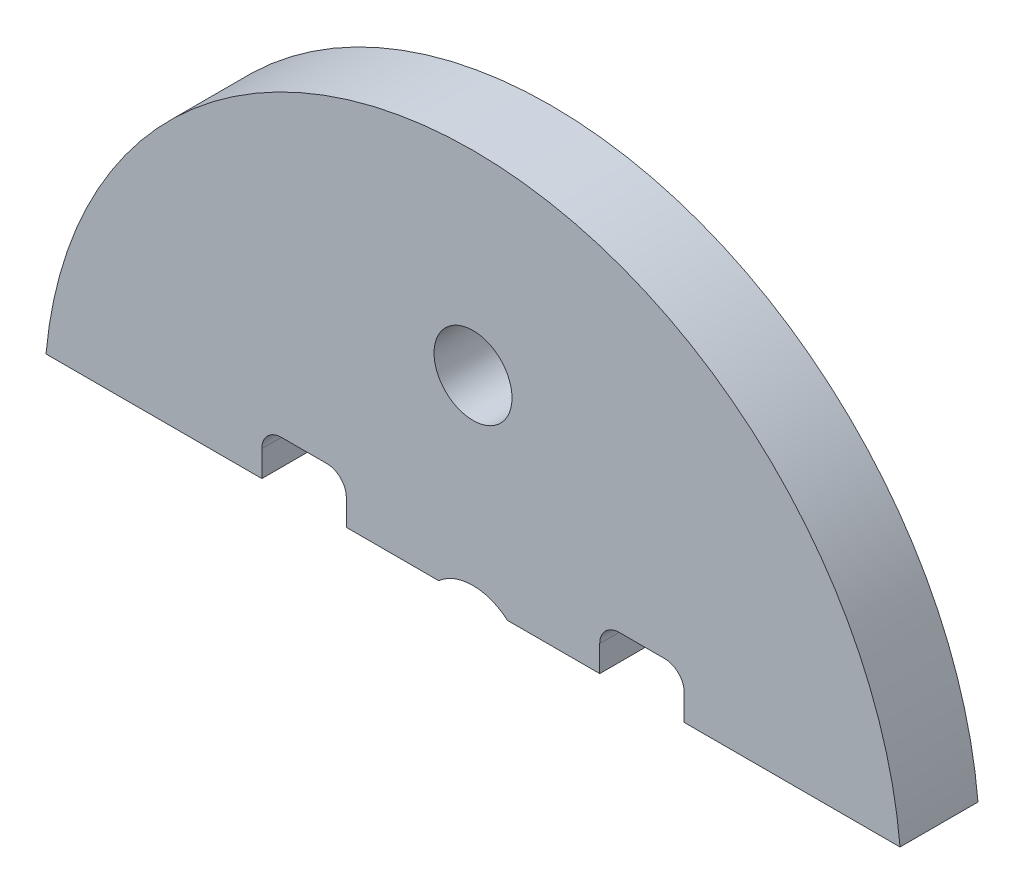
ISO-10303-21;
HEADER;
FILE_DESCRIPTION(('STEP AP214'),'2;1');
FILE_NAME('part.step','',(''),(''),'','','');
FILE_SCHEMA(('AUTOMOTIVE_DESIGN { 1 0 10303 214 1 1 1 1 }'));
ENDSEC;
DATA;
#1=APPLICATION_CONTEXT('core data for automotive mechanical design processes');
#2=APPLICATION_PROTOCOL_DEFINITION('international standard','automotive_design',2000,#1);
#3=PRODUCT_CONTEXT('',#1,'mechanical');
#4=PRODUCT('Part','Part','',(#3));
#5=PRODUCT_RELATED_PRODUCT_CATEGORY('part','',(#4));
#6=PRODUCT_DEFINITION_FORMATION('','',#4);
#7=PRODUCT_DEFINITION_CONTEXT('part definition',#1,'design');
#8=PRODUCT_DEFINITION('design','',#6,#7);
#9=PRODUCT_DEFINITION_SHAPE('','',#8);
#10=(LENGTH_UNIT() NAMED_UNIT(*) SI_UNIT(.MILLI.,.METRE.));
#11=(NAMED_UNIT(*) PLANE_ANGLE_UNIT() SI_UNIT($,.RADIAN.));
#12=(NAMED_UNIT(*) SI_UNIT($,.STERADIAN.) SOLID_ANGLE_UNIT());
#13=UNCERTAINTY_MEASURE_WITH_UNIT(LENGTH_MEASURE(1.E-05),#10,'distance_accuracy_value','');
#14=(GEOMETRIC_REPRESENTATION_CONTEXT(3) GLOBAL_UNCERTAINTY_ASSIGNED_CONTEXT((#13)) GLOBAL_UNIT_ASSIGNED_CONTEXT((#10,
#11,#12)) REPRESENTATION_CONTEXT('',''));
#15=CARTESIAN_POINT('',(0.,0.,0.));
#16=DIRECTION('',(0.,0.,1.));
#17=DIRECTION('',(1.,0.,0.));
#18=AXIS2_PLACEMENT_3D('',#15,#16,#17);
#19=CARTESIAN_POINT('',(221.3728079135,244.4520199932,3.));
#20=DIRECTION('',(0.,0.,1.));
#21=DIRECTION('',(1.,0.,0.));
#22=AXIS2_PLACEMENT_3D('',#19,#20,#21);
#23=PLANE('',#22);
#24=CARTESIAN_POINT('',(221.3728079135,244.4520199932,3.));
#25=DIRECTION('',(0.,0.,-1.));
#26=DIRECTION('',(1.,0.,0.));
#27=AXIS2_PLACEMENT_3D('',#24,#25,#26);
#28=CIRCLE('',#27,0.750000000000001);
#29=CARTESIAN_POINT('',(220.6228079135,244.4520199932,3.));
#30=VERTEX_POINT('',#29);
#31=CARTESIAN_POINT('',(221.3728079135,245.2020199932,3.));
#32=VERTEX_POINT('',#31);
#33=EDGE_CURVE('E209',#30,#32,#28,.T.);
#34=ORIENTED_EDGE('',*,*,#33,.T.);
#35=DIRECTION('',(1.,0.,0.));
#36=VECTOR('',#35,1.);
#37=CARTESIAN_POINT('',(223.1228079135,245.2020199932,3.));
#38=LINE('',#37,#36);
#39=CARTESIAN_POINT('',(223.1228079135,245.2020199932,3.));
#40=VERTEX_POINT('',#39);
#41=EDGE_CURVE('E117',#32,#40,#38,.T.);
#42=ORIENTED_EDGE('',*,*,#41,.T.);
#43=CARTESIAN_POINT('',(223.1228079135,244.4520199932,3.));
#44=DIRECTION('',(0.,0.,-1.));
#45=DIRECTION('',(1.,0.,0.));
#46=AXIS2_PLACEMENT_3D('',#43,#44,#45);
#47=CIRCLE('',#46,0.750000000000001);
#48=CARTESIAN_POINT('',(223.8728079135,244.4520199932,3.));
#49=VERTEX_POINT('',#48);
#50=EDGE_CURVE('E248',#40,#49,#47,.T.);
#51=ORIENTED_EDGE('',*,*,#50,.T.);
#52=DIRECTION('',(0.,-1.,0.));
#53=VECTOR('',#52,1.);
#54=CARTESIAN_POINT('',(223.8728079135,243.4520199932,3.));
#55=LINE('',#54,#53);
#56=CARTESIAN_POINT('',(223.8728079135,243.4520199932,3.));
#57=VERTEX_POINT('',#56);
#58=EDGE_CURVE('E267',#49,#57,#55,.T.);
#59=ORIENTED_EDGE('',*,*,#58,.T.);
#60=DIRECTION('',(1.,0.,0.));
#61=VECTOR('',#60,1.);
#62=CARTESIAN_POINT('',(223.8728079135,243.4520199932,3.));
#63=LINE('',#62,#61);
#64=CARTESIAN_POINT('',(232.1794846387,243.4520199932,3.));
#65=VERTEX_POINT('',#64);
#66=EDGE_CURVE('E264',#57,#65,#63,.T.);
#67=ORIENTED_EDGE('',*,*,#66,.T.);
#68=CARTESIAN_POINT('',(215.7478079135,241.952019993172,3.));
#69=DIRECTION('',(0.,0.,1.));
#70=DIRECTION('',(1.,0.,0.));
#71=AXIS2_PLACEMENT_3D('',#68,#69,#70);
#72=CIRCLE('',#71,16.4999999999976);
#73=CARTESIAN_POINT('',(199.31613118835,243.452019993205,3.));
#74=VERTEX_POINT('',#73);
#75=EDGE_CURVE('E266',#65,#74,#72,.T.);
#76=ORIENTED_EDGE('',*,*,#75,.T.);
#77=DIRECTION('',(1.,0.,0.));
#78=VECTOR('',#77,1.);
#79=CARTESIAN_POINT('',(199.3161311884,243.4520199932,3.));
#80=LINE('',#79,#78);
#81=CARTESIAN_POINT('',(207.6228079135,243.4520199932,3.));
#82=VERTEX_POINT('',#81);
#83=EDGE_CURVE('E269',#74,#82,#80,.T.);
#84=ORIENTED_EDGE('',*,*,#83,.T.);
#85=DIRECTION('',(0.,1.,0.));
#86=VECTOR('',#85,1.);
#87=CARTESIAN_POINT('',(207.6228079135,243.4520199932,3.));
#88=LINE('',#87,#86);
#89=CARTESIAN_POINT('',(207.6228079135,244.4520199932,3.));
#90=VERTEX_POINT('',#89);
#91=EDGE_CURVE('E275',#82,#90,#88,.T.);
#92=ORIENTED_EDGE('',*,*,#91,.T.);
#93=CARTESIAN_POINT('',(208.3728079135,244.4520199932,3.));
#94=DIRECTION('',(0.,0.,-1.));
#95=DIRECTION('',(1.,0.,0.));
#96=AXIS2_PLACEMENT_3D('',#93,#94,#95);
#97=CIRCLE('',#96,0.750000000000001);
#98=CARTESIAN_POINT('',(208.3728079135,245.2020199932,3.));
#99=VERTEX_POINT('',#98);
#100=EDGE_CURVE('E277',#90,#99,#97,.T.);
#101=ORIENTED_EDGE('',*,*,#100,.T.);
#102=DIRECTION('',(1.,0.,0.));
#103=VECTOR('',#102,1.);
#104=CARTESIAN_POINT('',(208.3728079135,245.2020199932,3.));
#105=LINE('',#104,#103);
#106=CARTESIAN_POINT('',(210.1228079135,245.2020199932,3.));
#107=VERTEX_POINT('',#106);
#108=EDGE_CURVE('E279',#99,#107,#105,.T.);
#109=ORIENTED_EDGE('',*,*,#108,.T.);
#110=CARTESIAN_POINT('',(210.1228079135,244.4520199932,3.));
#111=DIRECTION('',(0.,0.,-1.));
#112=DIRECTION('',(1.,0.,0.));
#113=AXIS2_PLACEMENT_3D('',#110,#111,#112);
#114=CIRCLE('',#113,0.750000000000001);
#115=CARTESIAN_POINT('',(210.8728079135,244.4520199932,3.));
#116=VERTEX_POINT('',#115);
#117=EDGE_CURVE('E281',#107,#116,#114,.T.);
#118=ORIENTED_EDGE('',*,*,#117,.T.);
#119=DIRECTION('',(0.,-1.,0.));
#120=VECTOR('',#119,1.);
#121=CARTESIAN_POINT('',(210.8728079135,244.4520199932,3.));
#122=LINE('',#121,#120);
#123=CARTESIAN_POINT('',(210.8728079135,243.4520199932,3.));
#124=VERTEX_POINT('',#123);
#125=EDGE_CURVE('E283',#116,#124,#122,.T.);
#126=ORIENTED_EDGE('',*,*,#125,.T.);
#127=DIRECTION('',(1.,0.,0.));
#128=VECTOR('',#127,1.);
#129=CARTESIAN_POINT('',(210.8728079135,243.4520199932,3.));
#130=LINE('',#129,#128);
#131=CARTESIAN_POINT('',(214.424932258,243.4520199932,3.));
#132=VERTEX_POINT('',#131);
#133=EDGE_CURVE('E160',#124,#132,#130,.T.);
#134=ORIENTED_EDGE('',*,*,#133,.T.);
#135=CARTESIAN_POINT('',(215.7478079135,241.952019993172,3.));
#136=DIRECTION('',(0.,0.,-1.));
#137=DIRECTION('',(1.,0.,0.));
#138=AXIS2_PLACEMENT_3D('',#135,#136,#137);
#139=CIRCLE('',#138,1.99999999999998);
#140=CARTESIAN_POINT('',(217.070683569,243.4520199932,3.));
#141=VERTEX_POINT('',#140);
#142=EDGE_CURVE('E154',#132,#141,#139,.T.);
#143=ORIENTED_EDGE('',*,*,#142,.T.);
#144=DIRECTION('',(1.,0.,0.));
#145=VECTOR('',#144,1.);
#146=CARTESIAN_POINT('',(217.070683569,243.4520199932,3.));
#147=LINE('',#146,#145);
#148=CARTESIAN_POINT('',(220.6228079135,243.4520199932,3.));
#149=VERTEX_POINT('',#148);
#150=EDGE_CURVE('E158',#141,#149,#147,.T.);
#151=ORIENTED_EDGE('',*,*,#150,.T.);
#152=DIRECTION('',(0.,1.,0.));
#153=VECTOR('',#152,1.);
#154=CARTESIAN_POINT('',(220.6228079135,244.4520199932,3.));
#155=LINE('',#154,#153);
#156=EDGE_CURVE('E50',#149,#30,#155,.T.);
#157=ORIENTED_EDGE('',*,*,#156,.T.);
#158=EDGE_LOOP('',(#34,#42,#51,#59,#67,#76,#84,#92,#101,#109,#118,#126,#134,#143,#151,#157));
#159=FACE_BOUND('',#158,.T.);
#160=CARTESIAN_POINT('',(215.7478079135,250.9520199932,3.));
#161=DIRECTION('',(0.,0.,1.));
#162=DIRECTION('',(1.,0.,0.));
#163=AXIS2_PLACEMENT_3D('',#160,#161,#162);
#164=CIRCLE('',#163,1.5);
#165=CARTESIAN_POINT('',(217.2478079135,250.9520199932,3.));
#166=VERTEX_POINT('',#165);
#167=EDGE_CURVE('E182',#166,#166,#164,.T.);
#168=ORIENTED_EDGE('',*,*,#167,.F.);
#169=EDGE_LOOP('',(#168));
#170=FACE_BOUND('',#169,.T.);
#171=ADVANCED_FACE('F33',(#159,#170),#23,.T.);
#172=CARTESIAN_POINT('',(221.3728079135,244.4520199932,0.));
#173=DIRECTION('',(0.,0.,1.));
#174=DIRECTION('',(1.,0.,0.));
#175=AXIS2_PLACEMENT_3D('',#172,#173,#174);
#176=PLANE('',#175);
#177=CARTESIAN_POINT('',(221.3728079135,244.4520199932,0.));
#178=DIRECTION('',(0.,0.,-1.));
#179=DIRECTION('',(1.,0.,0.));
#180=AXIS2_PLACEMENT_3D('',#177,#178,#179);
#181=CIRCLE('',#180,0.750000000000001);
#182=CARTESIAN_POINT('',(220.6228079135,244.4520199932,0.));
#183=VERTEX_POINT('',#182);
#184=CARTESIAN_POINT('',(221.3728079135,245.2020199932,0.));
#185=VERTEX_POINT('',#184);
#186=EDGE_CURVE('E178',#183,#185,#181,.T.);
#187=ORIENTED_EDGE('',*,*,#186,.F.);
#188=DIRECTION('',(0.,1.,0.));
#189=VECTOR('',#188,1.);
#190=CARTESIAN_POINT('',(220.6228079135,244.4520199932,0.));
#191=LINE('',#190,#189);
#192=CARTESIAN_POINT('',(220.6228079135,243.4520199932,0.));
#193=VERTEX_POINT('',#192);
#194=EDGE_CURVE('E109',#193,#183,#191,.T.);
#195=ORIENTED_EDGE('',*,*,#194,.F.);
#196=DIRECTION('',(1.,0.,0.));
#197=VECTOR('',#196,1.);
#198=CARTESIAN_POINT('',(217.070683569,243.4520199932,0.));
#199=LINE('',#198,#197);
#200=CARTESIAN_POINT('',(217.070683569,243.4520199932,0.));
#201=VERTEX_POINT('',#200);
#202=EDGE_CURVE('E103',#201,#193,#199,.T.);
#203=ORIENTED_EDGE('',*,*,#202,.F.);
#204=CARTESIAN_POINT('',(215.7478079135,241.952019993172,0.));
#205=DIRECTION('',(0.,0.,-1.));
#206=DIRECTION('',(1.,0.,0.));
#207=AXIS2_PLACEMENT_3D('',#204,#205,#206);
#208=CIRCLE('',#207,1.99999999999998);
#209=CARTESIAN_POINT('',(214.424932258,243.4520199932,0.));
#210=VERTEX_POINT('',#209);
#211=EDGE_CURVE('E168',#210,#201,#208,.T.);
#212=ORIENTED_EDGE('',*,*,#211,.F.);
#213=DIRECTION('',(1.,0.,0.));
#214=VECTOR('',#213,1.);
#215=CARTESIAN_POINT('',(210.8728079135,243.4520199932,0.));
#216=LINE('',#215,#214);
#217=CARTESIAN_POINT('',(210.8728079135,243.4520199932,0.));
#218=VERTEX_POINT('',#217);
#219=EDGE_CURVE('E204',#218,#210,#216,.T.);
#220=ORIENTED_EDGE('',*,*,#219,.F.);
#221=DIRECTION('',(0.,-1.,0.));
#222=VECTOR('',#221,1.);
#223=CARTESIAN_POINT('',(210.8728079135,244.4520199932,0.));
#224=LINE('',#223,#222);
#225=CARTESIAN_POINT('',(210.8728079135,244.4520199932,0.));
#226=VERTEX_POINT('',#225);
#227=EDGE_CURVE('E202',#226,#218,#224,.T.);
#228=ORIENTED_EDGE('',*,*,#227,.F.);
#229=CARTESIAN_POINT('',(210.1228079135,244.4520199932,0.));
#230=DIRECTION('',(0.,0.,-1.));
#231=DIRECTION('',(1.,0.,0.));
#232=AXIS2_PLACEMENT_3D('',#229,#230,#231);
#233=CIRCLE('',#232,0.750000000000001);
#234=CARTESIAN_POINT('',(210.1228079135,245.2020199932,0.));
#235=VERTEX_POINT('',#234);
#236=EDGE_CURVE('E200',#235,#226,#233,.T.);
#237=ORIENTED_EDGE('',*,*,#236,.F.);
#238=DIRECTION('',(1.,0.,0.));
#239=VECTOR('',#238,1.);
#240=CARTESIAN_POINT('',(208.3728079135,245.2020199932,0.));
#241=LINE('',#240,#239);
#242=CARTESIAN_POINT('',(208.3728079135,245.2020199932,0.));
#243=VERTEX_POINT('',#242);
#244=EDGE_CURVE('E198',#243,#235,#241,.T.);
#245=ORIENTED_EDGE('',*,*,#244,.F.);
#246=CARTESIAN_POINT('',(208.3728079135,244.4520199932,0.));
#247=DIRECTION('',(0.,0.,-1.));
#248=DIRECTION('',(1.,0.,0.));
#249=AXIS2_PLACEMENT_3D('',#246,#247,#248);
#250=CIRCLE('',#249,0.750000000000001);
#251=CARTESIAN_POINT('',(207.6228079135,244.4520199932,0.));
#252=VERTEX_POINT('',#251);
#253=EDGE_CURVE('E196',#252,#243,#250,.T.);
#254=ORIENTED_EDGE('',*,*,#253,.F.);
#255=DIRECTION('',(0.,1.,0.));
#256=VECTOR('',#255,1.);
#257=CARTESIAN_POINT('',(207.6228079135,243.4520199932,0.));
#258=LINE('',#257,#256);
#259=CARTESIAN_POINT('',(207.6228079135,243.4520199932,0.));
#260=VERTEX_POINT('',#259);
#261=EDGE_CURVE('E194',#260,#252,#258,.T.);
#262=ORIENTED_EDGE('',*,*,#261,.F.);
#263=DIRECTION('',(1.,0.,0.));
#264=VECTOR('',#263,1.);
#265=CARTESIAN_POINT('',(199.3161311884,243.4520199932,0.));
#266=LINE('',#265,#264);
#267=CARTESIAN_POINT('',(199.31613118835,243.452019993205,0.));
#268=VERTEX_POINT('',#267);
#269=EDGE_CURVE('E192',#268,#260,#266,.T.);
#270=ORIENTED_EDGE('',*,*,#269,.F.);
#271=CARTESIAN_POINT('',(215.7478079135,241.952019993172,0.));
#272=DIRECTION('',(0.,0.,1.));
#273=DIRECTION('',(1.,0.,0.));
#274=AXIS2_PLACEMENT_3D('',#271,#272,#273);
#275=CIRCLE('',#274,16.4999999999976);
#276=CARTESIAN_POINT('',(232.1794846387,243.4520199932,0.));
#277=VERTEX_POINT('',#276);
#278=EDGE_CURVE('E190',#277,#268,#275,.T.);
#279=ORIENTED_EDGE('',*,*,#278,.F.);
#280=DIRECTION('',(1.,0.,0.));
#281=VECTOR('',#280,1.);
#282=CARTESIAN_POINT('',(223.8728079135,243.4520199932,0.));
#283=LINE('',#282,#281);
#284=CARTESIAN_POINT('',(223.8728079135,243.4520199932,0.));
#285=VERTEX_POINT('',#284);
#286=EDGE_CURVE('E188',#285,#277,#283,.T.);
#287=ORIENTED_EDGE('',*,*,#286,.F.);
#288=DIRECTION('',(0.,-1.,0.));
#289=VECTOR('',#288,1.);
#290=CARTESIAN_POINT('',(223.8728079135,243.4520199932,0.));
#291=LINE('',#290,#289);
#292=CARTESIAN_POINT('',(223.8728079135,244.4520199932,0.));
#293=VERTEX_POINT('',#292);
#294=EDGE_CURVE('E186',#293,#285,#291,.T.);
#295=ORIENTED_EDGE('',*,*,#294,.F.);
#296=CARTESIAN_POINT('',(223.1228079135,244.4520199932,0.));
#297=DIRECTION('',(0.,0.,-1.));
#298=DIRECTION('',(1.,0.,0.));
#299=AXIS2_PLACEMENT_3D('',#296,#297,#298);
#300=CIRCLE('',#299,0.750000000000001);
#301=CARTESIAN_POINT('',(223.1228079135,245.2020199932,0.));
#302=VERTEX_POINT('',#301);
#303=EDGE_CURVE('E184',#302,#293,#300,.T.);
#304=ORIENTED_EDGE('',*,*,#303,.F.);
#305=DIRECTION('',(1.,0.,0.));
#306=VECTOR('',#305,1.);
#307=CARTESIAN_POINT('',(223.1228079135,245.2020199932,0.));
#308=LINE('',#307,#306);
#309=EDGE_CURVE('E181',#185,#302,#308,.T.);
#310=ORIENTED_EDGE('',*,*,#309,.F.);
#311=EDGE_LOOP('',(#187,#195,#203,#212,#220,#228,#237,#245,#254,#262,#270,#279,#287,#295,#304,#310));
#312=FACE_BOUND('',#311,.T.);
#313=CARTESIAN_POINT('',(215.7478079135,250.9520199932,0.));
#314=DIRECTION('',(0.,0.,1.));
#315=DIRECTION('',(1.,0.,0.));
#316=AXIS2_PLACEMENT_3D('',#313,#314,#315);
#317=CIRCLE('',#316,1.5);
#318=CARTESIAN_POINT('',(217.2478079135,250.9520199932,0.));
#319=VERTEX_POINT('',#318);
#320=EDGE_CURVE('E482',#319,#319,#317,.T.);
#321=ORIENTED_EDGE('',*,*,#320,.T.);
#322=EDGE_LOOP('',(#321));
#323=FACE_BOUND('',#322,.T.);
#324=ADVANCED_FACE('F252',(#312,#323),#176,.F.);
#325=CARTESIAN_POINT('',(221.3728079135,244.4520199932,3.));
#326=DIRECTION('',(0.,0.,-1.));
#327=DIRECTION('',(-1.,0.,0.));
#328=AXIS2_PLACEMENT_3D('',#325,#326,#327);
#329=CYLINDRICAL_SURFACE('',#328,0.750000000000001);
#330=ORIENTED_EDGE('',*,*,#186,.T.);
#331=DIRECTION('',(0.,0.,-1.));
#332=VECTOR('',#331,1.);
#333=CARTESIAN_POINT('',(221.3728079135,245.2020199932,3.));
#334=LINE('',#333,#332);
#335=EDGE_CURVE('E11',#32,#185,#334,.T.);
#336=ORIENTED_EDGE('',*,*,#335,.F.);
#337=ORIENTED_EDGE('',*,*,#33,.F.);
#338=DIRECTION('',(0.,0.,-1.));
#339=VECTOR('',#338,1.);
#340=CARTESIAN_POINT('',(220.6228079135,244.4520199932,3.));
#341=LINE('',#340,#339);
#342=EDGE_CURVE('E174',#30,#183,#341,.T.);
#343=ORIENTED_EDGE('',*,*,#342,.T.);
#344=EDGE_LOOP('',(#330,#336,#337,#343));
#345=FACE_BOUND('',#344,.T.);
#346=ADVANCED_FACE('F35',(#345),#329,.F.);
#347=CARTESIAN_POINT('',(223.1228079135,245.2020199932,3.));
#348=DIRECTION('',(0.,1.,0.));
#349=DIRECTION('',(0.,0.,1.));
#350=AXIS2_PLACEMENT_3D('',#347,#348,#349);
#351=PLANE('',#350);
#352=ORIENTED_EDGE('',*,*,#309,.T.);
#353=DIRECTION('',(0.,0.,-1.));
#354=VECTOR('',#353,1.);
#355=CARTESIAN_POINT('',(223.1228079135,245.2020199932,3.));
#356=LINE('',#355,#354);
#357=EDGE_CURVE('E42',#40,#302,#356,.T.);
#358=ORIENTED_EDGE('',*,*,#357,.F.);
#359=ORIENTED_EDGE('',*,*,#41,.F.);
#360=ORIENTED_EDGE('',*,*,#335,.T.);
#361=EDGE_LOOP('',(#352,#358,#359,#360));
#362=FACE_BOUND('',#361,.T.);
#363=ADVANCED_FACE('F317',(#362),#351,.F.);
#364=CARTESIAN_POINT('',(223.1228079135,244.4520199932,3.));
#365=DIRECTION('',(0.,0.,-1.));
#366=DIRECTION('',(-1.,0.,0.));
#367=AXIS2_PLACEMENT_3D('',#364,#365,#366);
#368=CYLINDRICAL_SURFACE('',#367,0.750000000000001);
#369=ORIENTED_EDGE('',*,*,#303,.T.);
#370=DIRECTION('',(0.,0.,-1.));
#371=VECTOR('',#370,1.);
#372=CARTESIAN_POINT('',(223.8728079135,244.4520199932,3.));
#373=LINE('',#372,#371);
#374=EDGE_CURVE('E240',#49,#293,#373,.T.);
#375=ORIENTED_EDGE('',*,*,#374,.F.);
#376=ORIENTED_EDGE('',*,*,#50,.F.);
#377=ORIENTED_EDGE('',*,*,#357,.T.);
#378=EDGE_LOOP('',(#369,#375,#376,#377));
#379=FACE_BOUND('',#378,.T.);
#380=ADVANCED_FACE('F246',(#379),#368,.F.);
#381=CARTESIAN_POINT('',(223.8728079135,243.4520199932,3.));
#382=DIRECTION('',(1.,0.,0.));
#383=DIRECTION('',(0.,0.,-1.));
#384=AXIS2_PLACEMENT_3D('',#381,#382,#383);
#385=PLANE('',#384);
#386=ORIENTED_EDGE('',*,*,#294,.T.);
#387=DIRECTION('',(0.,0.,-1.));
#388=VECTOR('',#387,1.);
#389=CARTESIAN_POINT('',(223.8728079135,243.4520199932,3.));
#390=LINE('',#389,#388);
#391=EDGE_CURVE('E237',#57,#285,#390,.T.);
#392=ORIENTED_EDGE('',*,*,#391,.F.);
#393=ORIENTED_EDGE('',*,*,#58,.F.);
#394=ORIENTED_EDGE('',*,*,#374,.T.);
#395=EDGE_LOOP('',(#386,#392,#393,#394));
#396=FACE_BOUND('',#395,.T.);
#397=ADVANCED_FACE('F258',(#396),#385,.F.);
#398=CARTESIAN_POINT('',(223.8728079135,243.4520199932,3.));
#399=DIRECTION('',(0.,1.,0.));
#400=DIRECTION('',(0.,0.,1.));
#401=AXIS2_PLACEMENT_3D('',#398,#399,#400);
#402=PLANE('',#401);
#403=ORIENTED_EDGE('',*,*,#286,.T.);
#404=DIRECTION('',(0.,0.,-1.));
#405=VECTOR('',#404,1.);
#406=CARTESIAN_POINT('',(232.1794846387,243.4520199932,3.));
#407=LINE('',#406,#405);
#408=EDGE_CURVE('E234',#65,#277,#407,.T.);
#409=ORIENTED_EDGE('',*,*,#408,.F.);
#410=ORIENTED_EDGE('',*,*,#66,.F.);
#411=ORIENTED_EDGE('',*,*,#391,.T.);
#412=EDGE_LOOP('',(#403,#409,#410,#411));
#413=FACE_BOUND('',#412,.T.);
#414=ADVANCED_FACE('F262',(#413),#402,.F.);
#415=CARTESIAN_POINT('',(215.7478079135,241.952019993172,3.));
#416=DIRECTION('',(0.,0.,-1.));
#417=DIRECTION('',(-1.,0.,0.));
#418=AXIS2_PLACEMENT_3D('',#415,#416,#417);
#419=CYLINDRICAL_SURFACE('',#418,16.4999999999976);
#420=ORIENTED_EDGE('',*,*,#278,.T.);
#421=DIRECTION('',(0.,0.,-1.));
#422=VECTOR('',#421,1.);
#423=CARTESIAN_POINT('',(199.31613118835,243.452019993205,3.));
#424=LINE('',#423,#422);
#425=EDGE_CURVE('E231',#74,#268,#424,.T.);
#426=ORIENTED_EDGE('',*,*,#425,.F.);
#427=ORIENTED_EDGE('',*,*,#75,.F.);
#428=ORIENTED_EDGE('',*,*,#408,.T.);
#429=EDGE_LOOP('',(#420,#426,#427,#428));
#430=FACE_BOUND('',#429,.T.);
#431=ADVANCED_FACE('F330',(#430),#419,.T.);
#432=CARTESIAN_POINT('',(199.3161311884,243.4520199932,3.));
#433=DIRECTION('',(0.,1.,0.));
#434=DIRECTION('',(0.,0.,1.));
#435=AXIS2_PLACEMENT_3D('',#432,#433,#434);
#436=PLANE('',#435);
#437=ORIENTED_EDGE('',*,*,#269,.T.);
#438=DIRECTION('',(0.,0.,-1.));
#439=VECTOR('',#438,1.);
#440=CARTESIAN_POINT('',(207.6228079135,243.4520199932,3.));
#441=LINE('',#440,#439);
#442=EDGE_CURVE('E228',#82,#260,#441,.T.);
#443=ORIENTED_EDGE('',*,*,#442,.F.);
#444=ORIENTED_EDGE('',*,*,#83,.F.);
#445=ORIENTED_EDGE('',*,*,#425,.T.);
#446=EDGE_LOOP('',(#437,#443,#444,#445));
#447=FACE_BOUND('',#446,.T.);
#448=ADVANCED_FACE('F333',(#447),#436,.F.);
#449=CARTESIAN_POINT('',(207.6228079135,243.4520199932,3.));
#450=DIRECTION('',(-1.,0.,0.));
#451=DIRECTION('',(0.,0.,1.));
#452=AXIS2_PLACEMENT_3D('',#449,#450,#451);
#453=PLANE('',#452);
#454=ORIENTED_EDGE('',*,*,#261,.T.);
#455=DIRECTION('',(0.,0.,-1.));
#456=VECTOR('',#455,1.);
#457=CARTESIAN_POINT('',(207.6228079135,244.4520199932,3.));
#458=LINE('',#457,#456);
#459=EDGE_CURVE('E225',#90,#252,#458,.T.);
#460=ORIENTED_EDGE('',*,*,#459,.F.);
#461=ORIENTED_EDGE('',*,*,#91,.F.);
#462=ORIENTED_EDGE('',*,*,#442,.T.);
#463=EDGE_LOOP('',(#454,#460,#461,#462));
#464=FACE_BOUND('',#463,.T.);
#465=ADVANCED_FACE('F337',(#464),#453,.F.);
#466=CARTESIAN_POINT('',(208.3728079135,244.4520199932,3.));
#467=DIRECTION('',(0.,0.,-1.));
#468=DIRECTION('',(-1.,0.,0.));
#469=AXIS2_PLACEMENT_3D('',#466,#467,#468);
#470=CYLINDRICAL_SURFACE('',#469,0.750000000000001);
#471=ORIENTED_EDGE('',*,*,#253,.T.);
#472=DIRECTION('',(0.,0.,-1.));
#473=VECTOR('',#472,1.);
#474=CARTESIAN_POINT('',(208.3728079135,245.2020199932,3.));
#475=LINE('',#474,#473);
#476=EDGE_CURVE('E222',#99,#243,#475,.T.);
#477=ORIENTED_EDGE('',*,*,#476,.F.);
#478=ORIENTED_EDGE('',*,*,#100,.F.);
#479=ORIENTED_EDGE('',*,*,#459,.T.);
#480=EDGE_LOOP('',(#471,#477,#478,#479));
#481=FACE_BOUND('',#480,.T.);
#482=ADVANCED_FACE('F341',(#481),#470,.F.);
#483=CARTESIAN_POINT('',(208.3728079135,245.2020199932,3.));
#484=DIRECTION('',(0.,1.,0.));
#485=DIRECTION('',(0.,0.,1.));
#486=AXIS2_PLACEMENT_3D('',#483,#484,#485);
#487=PLANE('',#486);
#488=ORIENTED_EDGE('',*,*,#244,.T.);
#489=DIRECTION('',(0.,0.,-1.));
#490=VECTOR('',#489,1.);
#491=CARTESIAN_POINT('',(210.1228079135,245.2020199932,3.));
#492=LINE('',#491,#490);
#493=EDGE_CURVE('E219',#107,#235,#492,.T.);
#494=ORIENTED_EDGE('',*,*,#493,.F.);
#495=ORIENTED_EDGE('',*,*,#108,.F.);
#496=ORIENTED_EDGE('',*,*,#476,.T.);
#497=EDGE_LOOP('',(#488,#494,#495,#496));
#498=FACE_BOUND('',#497,.T.);
#499=ADVANCED_FACE('F345',(#498),#487,.F.);
#500=CARTESIAN_POINT('',(210.1228079135,244.4520199932,3.));
#501=DIRECTION('',(0.,0.,-1.));
#502=DIRECTION('',(-1.,0.,0.));
#503=AXIS2_PLACEMENT_3D('',#500,#501,#502);
#504=CYLINDRICAL_SURFACE('',#503,0.750000000000001);
#505=ORIENTED_EDGE('',*,*,#236,.T.);
#506=DIRECTION('',(0.,0.,-1.));
#507=VECTOR('',#506,1.);
#508=CARTESIAN_POINT('',(210.8728079135,244.4520199932,3.));
#509=LINE('',#508,#507);
#510=EDGE_CURVE('E216',#116,#226,#509,.T.);
#511=ORIENTED_EDGE('',*,*,#510,.F.);
#512=ORIENTED_EDGE('',*,*,#117,.F.);
#513=ORIENTED_EDGE('',*,*,#493,.T.);
#514=EDGE_LOOP('',(#505,#511,#512,#513));
#515=FACE_BOUND('',#514,.T.);
#516=ADVANCED_FACE('F349',(#515),#504,.F.);
#517=CARTESIAN_POINT('',(210.8728079135,244.4520199932,3.));
#518=DIRECTION('',(1.,0.,0.));
#519=DIRECTION('',(0.,0.,-1.));
#520=AXIS2_PLACEMENT_3D('',#517,#518,#519);
#521=PLANE('',#520);
#522=ORIENTED_EDGE('',*,*,#227,.T.);
#523=DIRECTION('',(0.,0.,-1.));
#524=VECTOR('',#523,1.);
#525=CARTESIAN_POINT('',(210.8728079135,243.4520199932,3.));
#526=LINE('',#525,#524);
#527=EDGE_CURVE('E213',#124,#218,#526,.T.);
#528=ORIENTED_EDGE('',*,*,#527,.F.);
#529=ORIENTED_EDGE('',*,*,#125,.F.);
#530=ORIENTED_EDGE('',*,*,#510,.T.);
#531=EDGE_LOOP('',(#522,#528,#529,#530));
#532=FACE_BOUND('',#531,.T.);
#533=ADVANCED_FACE('F289',(#532),#521,.F.);
#534=CARTESIAN_POINT('',(210.8728079135,243.4520199932,3.));
#535=DIRECTION('',(0.,1.,0.));
#536=DIRECTION('',(0.,0.,1.));
#537=AXIS2_PLACEMENT_3D('',#534,#535,#536);
#538=PLANE('',#537);
#539=ORIENTED_EDGE('',*,*,#219,.T.);
#540=DIRECTION('',(0.,0.,-1.));
#541=VECTOR('',#540,1.);
#542=CARTESIAN_POINT('',(214.424932258,243.4520199932,3.));
#543=LINE('',#542,#541);
#544=EDGE_CURVE('E169',#132,#210,#543,.T.);
#545=ORIENTED_EDGE('',*,*,#544,.F.);
#546=ORIENTED_EDGE('',*,*,#133,.F.);
#547=ORIENTED_EDGE('',*,*,#527,.T.);
#548=EDGE_LOOP('',(#539,#545,#546,#547));
#549=FACE_BOUND('',#548,.T.);
#550=ADVANCED_FACE('F293',(#549),#538,.F.);
#551=CARTESIAN_POINT('',(215.7478079135,241.952019993172,3.));
#552=DIRECTION('',(0.,0.,-1.));
#553=DIRECTION('',(-1.,0.,0.));
#554=AXIS2_PLACEMENT_3D('',#551,#552,#553);
#555=CYLINDRICAL_SURFACE('',#554,1.99999999999998);
#556=ORIENTED_EDGE('',*,*,#211,.T.);
#557=DIRECTION('',(0.,0.,-1.));
#558=VECTOR('',#557,1.);
#559=CARTESIAN_POINT('',(217.070683569,243.4520199932,3.));
#560=LINE('',#559,#558);
#561=EDGE_CURVE('E165',#141,#201,#560,.T.);
#562=ORIENTED_EDGE('',*,*,#561,.F.);
#563=ORIENTED_EDGE('',*,*,#142,.F.);
#564=ORIENTED_EDGE('',*,*,#544,.T.);
#565=EDGE_LOOP('',(#556,#562,#563,#564));
#566=FACE_BOUND('',#565,.T.);
#567=ADVANCED_FACE('F166',(#566),#555,.F.);
#568=CARTESIAN_POINT('',(217.070683569,243.4520199932,3.));
#569=DIRECTION('',(0.,1.,0.));
#570=DIRECTION('',(0.,0.,1.));
#571=AXIS2_PLACEMENT_3D('',#568,#569,#570);
#572=PLANE('',#571);
#573=ORIENTED_EDGE('',*,*,#202,.T.);
#574=DIRECTION('',(0.,0.,-1.));
#575=VECTOR('',#574,1.);
#576=CARTESIAN_POINT('',(220.6228079135,243.4520199932,3.));
#577=LINE('',#576,#575);
#578=EDGE_CURVE('E170',#149,#193,#577,.T.);
#579=ORIENTED_EDGE('',*,*,#578,.F.);
#580=ORIENTED_EDGE('',*,*,#150,.F.);
#581=ORIENTED_EDGE('',*,*,#561,.T.);
#582=EDGE_LOOP('',(#573,#579,#580,#581));
#583=FACE_BOUND('',#582,.T.);
#584=ADVANCED_FACE('F172',(#583),#572,.F.);
#585=CARTESIAN_POINT('',(220.6228079135,244.4520199932,3.));
#586=DIRECTION('',(-1.,0.,0.));
#587=DIRECTION('',(0.,0.,1.));
#588=AXIS2_PLACEMENT_3D('',#585,#586,#587);
#589=PLANE('',#588);
#590=ORIENTED_EDGE('',*,*,#194,.T.);
#591=ORIENTED_EDGE('',*,*,#342,.F.);
#592=ORIENTED_EDGE('',*,*,#156,.F.);
#593=ORIENTED_EDGE('',*,*,#578,.T.);
#594=EDGE_LOOP('',(#590,#591,#592,#593));
#595=FACE_BOUND('',#594,.T.);
#596=ADVANCED_FACE('F297',(#595),#589,.F.);
#597=CARTESIAN_POINT('',(215.7478079135,250.9520199932,3.));
#598=DIRECTION('',(0.,0.,-1.));
#599=DIRECTION('',(-1.,0.,0.));
#600=AXIS2_PLACEMENT_3D('',#597,#598,#599);
#601=CYLINDRICAL_SURFACE('',#600,1.5);
#602=ORIENTED_EDGE('',*,*,#167,.T.);
#603=EDGE_LOOP('',(#602));
#604=FACE_BOUND('',#603,.T.);
#605=ORIENTED_EDGE('',*,*,#320,.F.);
#606=EDGE_LOOP('',(#605));
#607=FACE_BOUND('',#606,.T.);
#608=ADVANCED_FACE('F299',(#604,#607),#601,.F.);
#609=CLOSED_SHELL('',(#171,#324,#346,#363,#380,#397,#414,#431,#448,#465,#482,#499,#516,#533,
#550,#567,#584,#596,#608));
#610=MANIFOLD_SOLID_BREP('B2',#609);
#611=ADVANCED_BREP_SHAPE_REPRESENTATION('',(#18,#610),#14);
#612=SHAPE_DEFINITION_REPRESENTATION(#9,#611);
ENDSEC;
END-ISO-10303-21;
